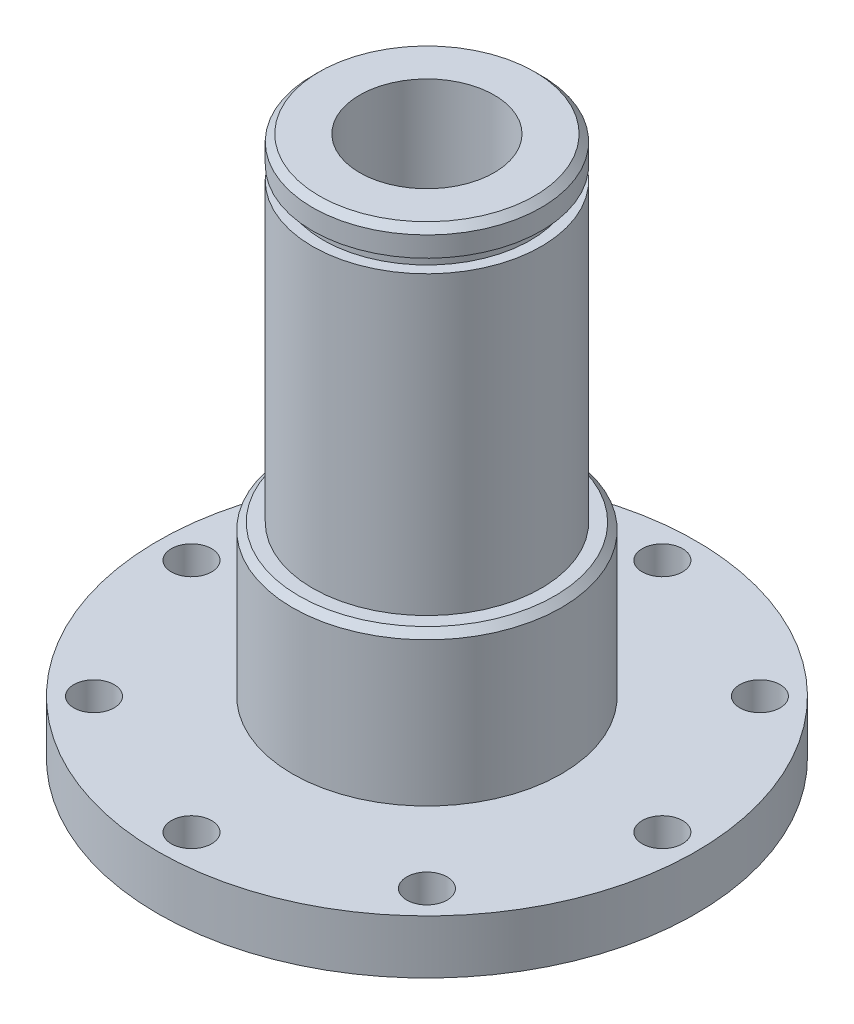
ISO-10303-21;
HEADER;
FILE_DESCRIPTION(('STEP AP214'),'2;1');
FILE_NAME('part.step','',(''),(''),'','','');
FILE_SCHEMA(('AUTOMOTIVE_DESIGN { 1 0 10303 214 1 1 1 1 }'));
ENDSEC;
DATA;
#1=APPLICATION_CONTEXT('core data for automotive mechanical design processes');
#2=APPLICATION_PROTOCOL_DEFINITION('international standard','automotive_design',2000,#1);
#3=PRODUCT_CONTEXT('',#1,'mechanical');
#4=PRODUCT('Part','Part','',(#3));
#5=PRODUCT_RELATED_PRODUCT_CATEGORY('part','',(#4));
#6=PRODUCT_DEFINITION_FORMATION('','',#4);
#7=PRODUCT_DEFINITION_CONTEXT('part definition',#1,'design');
#8=PRODUCT_DEFINITION('design','',#6,#7);
#9=PRODUCT_DEFINITION_SHAPE('','',#8);
#10=(LENGTH_UNIT() NAMED_UNIT(*) SI_UNIT(.MILLI.,.METRE.));
#11=(NAMED_UNIT(*) PLANE_ANGLE_UNIT() SI_UNIT($,.RADIAN.));
#12=(NAMED_UNIT(*) SI_UNIT($,.STERADIAN.) SOLID_ANGLE_UNIT());
#13=UNCERTAINTY_MEASURE_WITH_UNIT(LENGTH_MEASURE(1.E-05),#10,'distance_accuracy_value','');
#14=(GEOMETRIC_REPRESENTATION_CONTEXT(3) GLOBAL_UNCERTAINTY_ASSIGNED_CONTEXT((#13)) GLOBAL_UNIT_ASSIGNED_CONTEXT((#10,
#11,#12)) REPRESENTATION_CONTEXT('',''));
#15=CARTESIAN_POINT('',(0.,0.,0.));
#16=DIRECTION('',(0.,0.,1.));
#17=DIRECTION('',(1.,0.,0.));
#18=AXIS2_PLACEMENT_3D('',#15,#16,#17);
#19=CARTESIAN_POINT('',(0.,40.2,0.));
#20=DIRECTION('',(0.,-1.,0.));
#21=DIRECTION('',(0.,0.,-1.));
#22=AXIS2_PLACEMENT_3D('',#19,#20,#21);
#23=CYLINDRICAL_SURFACE('',#22,8.5);
#24=CARTESIAN_POINT('',(0.,15.2,0.));
#25=DIRECTION('',(0.,1.,0.));
#26=DIRECTION('',(0.,0.,1.));
#27=AXIS2_PLACEMENT_3D('',#24,#25,#26);
#28=CIRCLE('',#27,8.5);
#29=CARTESIAN_POINT('',(0.,15.2,8.5));
#30=VERTEX_POINT('',#29);
#31=EDGE_CURVE('E56',#30,#30,#28,.T.);
#32=ORIENTED_EDGE('',*,*,#31,.T.);
#33=EDGE_LOOP('',(#32));
#34=FACE_BOUND('',#33,.T.);
#35=CARTESIAN_POINT('',(0.,37.2,0.));
#36=DIRECTION('',(0.,1.,0.));
#37=DIRECTION('',(0.,0.,1.));
#38=AXIS2_PLACEMENT_3D('',#35,#36,#37);
#39=CIRCLE('',#38,8.5);
#40=CARTESIAN_POINT('',(0.,37.2,8.5));
#41=VERTEX_POINT('',#40);
#42=EDGE_CURVE('E120',#41,#41,#39,.T.);
#43=ORIENTED_EDGE('',*,*,#42,.F.);
#44=EDGE_LOOP('',(#43));
#45=FACE_BOUND('',#44,.T.);
#46=ADVANCED_FACE('F36',(#34,#45),#23,.T.);
#47=CARTESIAN_POINT('',(0.,39.7,0.));
#48=DIRECTION('',(0.,1.,0.));
#49=DIRECTION('',(0.,0.,1.));
#50=AXIS2_PLACEMENT_3D('',#47,#48,#49);
#51=CIRCLE('',#50,8.5);
#52=CARTESIAN_POINT('',(0.,39.7,8.5));
#53=VERTEX_POINT('',#52);
#54=EDGE_CURVE('E10',#53,#53,#51,.F.);
#55=ORIENTED_EDGE('',*,*,#54,.T.);
#56=EDGE_LOOP('',(#55));
#57=FACE_BOUND('',#56,.T.);
#58=CARTESIAN_POINT('',(0.,38.2,0.));
#59=DIRECTION('',(0.,1.,0.));
#60=DIRECTION('',(0.,0.,1.));
#61=AXIS2_PLACEMENT_3D('',#58,#59,#60);
#62=CIRCLE('',#61,8.5);
#63=CARTESIAN_POINT('',(0.,38.2,8.5));
#64=VERTEX_POINT('',#63);
#65=EDGE_CURVE('E131',#64,#64,#62,.T.);
#66=ORIENTED_EDGE('',*,*,#65,.T.);
#67=EDGE_LOOP('',(#66));
#68=FACE_BOUND('',#67,.T.);
#69=ADVANCED_FACE('F135',(#57,#68),#23,.T.);
#70=CARTESIAN_POINT('',(0.,4.,0.));
#71=DIRECTION('',(0.,-1.,0.));
#72=DIRECTION('',(0.,0.,-1.));
#73=AXIS2_PLACEMENT_3D('',#70,#71,#72);
#74=CYLINDRICAL_SURFACE('',#73,20.);
#75=CARTESIAN_POINT('',(0.,4.,0.));
#76=DIRECTION('',(0.,1.,0.));
#77=DIRECTION('',(0.,0.,1.));
#78=AXIS2_PLACEMENT_3D('',#75,#76,#77);
#79=CIRCLE('',#78,20.);
#80=CARTESIAN_POINT('',(0.,4.,20.));
#81=VERTEX_POINT('',#80);
#82=EDGE_CURVE('E60',#81,#81,#79,.T.);
#83=ORIENTED_EDGE('',*,*,#82,.F.);
#84=EDGE_LOOP('',(#83));
#85=FACE_BOUND('',#84,.T.);
#86=CARTESIAN_POINT('',(0.,0.,0.));
#87=DIRECTION('',(0.,1.,0.));
#88=DIRECTION('',(0.,0.,1.));
#89=AXIS2_PLACEMENT_3D('',#86,#87,#88);
#90=CIRCLE('',#89,20.);
#91=CARTESIAN_POINT('',(0.,0.,20.));
#92=VERTEX_POINT('',#91);
#93=EDGE_CURVE('E57',#92,#92,#90,.T.);
#94=ORIENTED_EDGE('',*,*,#93,.T.);
#95=EDGE_LOOP('',(#94));
#96=FACE_BOUND('',#95,.T.);
#97=ADVANCED_FACE('F157',(#85,#96),#74,.T.);
#98=CARTESIAN_POINT('',(0.,4.,0.));
#99=DIRECTION('',(0.,1.,0.));
#100=DIRECTION('',(0.,0.,1.));
#101=AXIS2_PLACEMENT_3D('',#98,#99,#100);
#102=PLANE('',#101);
#103=CARTESIAN_POINT('',(0.,4.,-17.5));
#104=DIRECTION('',(0.,1.,0.));
#105=DIRECTION('',(0.,0.,1.));
#106=AXIS2_PLACEMENT_3D('',#103,#104,#105);
#107=CIRCLE('',#106,1.5);
#108=CARTESIAN_POINT('',(0.,4.,-16.));
#109=VERTEX_POINT('',#108);
#110=EDGE_CURVE('E110',#109,#109,#107,.T.);
#111=ORIENTED_EDGE('',*,*,#110,.F.);
#112=EDGE_LOOP('',(#111));
#113=FACE_BOUND('',#112,.T.);
#114=CARTESIAN_POINT('',(12.3743686707648,4.,-12.3743686707651));
#115=DIRECTION('',(0.,1.,0.));
#116=DIRECTION('',(0.,0.,1.));
#117=AXIS2_PLACEMENT_3D('',#114,#115,#116);
#118=CIRCLE('',#117,1.50000000000009);
#119=CARTESIAN_POINT('',(12.3743686707648,4.,-10.874368670765));
#120=VERTEX_POINT('',#119);
#121=EDGE_CURVE('E104',#120,#120,#118,.T.);
#122=ORIENTED_EDGE('',*,*,#121,.F.);
#123=EDGE_LOOP('',(#122));
#124=FACE_BOUND('',#123,.T.);
#125=CARTESIAN_POINT('',(17.5000000000007,4.,-7.43926740649597E-13));
#126=DIRECTION('',(0.,1.,0.));
#127=DIRECTION('',(0.,0.,1.));
#128=AXIS2_PLACEMENT_3D('',#125,#126,#127);
#129=CIRCLE('',#128,1.50000000000055);
#130=CARTESIAN_POINT('',(17.5000000000007,4.,1.49999999999981));
#131=VERTEX_POINT('',#130);
#132=EDGE_CURVE('E98',#131,#131,#129,.T.);
#133=ORIENTED_EDGE('',*,*,#132,.F.);
#134=EDGE_LOOP('',(#133));
#135=FACE_BOUND('',#134,.T.);
#136=CARTESIAN_POINT('',(12.3743686707659,4.,12.3743686707641));
#137=DIRECTION('',(0.,1.,0.));
#138=DIRECTION('',(0.,0.,1.));
#139=AXIS2_PLACEMENT_3D('',#136,#137,#138);
#140=CIRCLE('',#139,1.50000000000115);
#141=CARTESIAN_POINT('',(12.3743686707659,4.,13.8743686707652));
#142=VERTEX_POINT('',#141);
#143=EDGE_CURVE('E92',#142,#142,#140,.T.);
#144=ORIENTED_EDGE('',*,*,#143,.F.);
#145=EDGE_LOOP('',(#144));
#146=FACE_BOUND('',#145,.T.);
#147=CARTESIAN_POINT('',(1.48785348129919E-12,4.,17.5));
#148=DIRECTION('',(0.,1.,0.));
#149=DIRECTION('',(0.,0.,1.));
#150=AXIS2_PLACEMENT_3D('',#147,#148,#149);
#151=CIRCLE('',#150,1.50000000000154);
#152=CARTESIAN_POINT('',(1.48785348129919E-12,4.,19.0000000000015));
#153=VERTEX_POINT('',#152);
#154=EDGE_CURVE('E86',#153,#153,#151,.T.);
#155=ORIENTED_EDGE('',*,*,#154,.F.);
#156=EDGE_LOOP('',(#155));
#157=FACE_BOUND('',#156,.T.);
#158=CARTESIAN_POINT('',(-12.3743686707633,4.,12.3743686707651));
#159=DIRECTION('',(0.,1.,0.));
#160=DIRECTION('',(0.,0.,1.));
#161=AXIS2_PLACEMENT_3D('',#158,#159,#160);
#162=CIRCLE('',#161,1.50000000000151);
#163=CARTESIAN_POINT('',(-12.3743686707633,4.,13.8743686707666));
#164=VERTEX_POINT('',#163);
#165=EDGE_CURVE('E80',#164,#164,#162,.T.);
#166=ORIENTED_EDGE('',*,*,#165,.F.);
#167=EDGE_LOOP('',(#166));
#168=FACE_BOUND('',#167,.T.);
#169=CARTESIAN_POINT('',(-17.4999999999993,4.,7.46069872548105E-13));
#170=DIRECTION('',(0.,1.,0.));
#171=DIRECTION('',(0.,0.,1.));
#172=AXIS2_PLACEMENT_3D('',#169,#170,#171);
#173=CIRCLE('',#172,1.50000000000111);
#174=CARTESIAN_POINT('',(-17.4999999999993,4.,1.50000000000185));
#175=VERTEX_POINT('',#174);
#176=EDGE_CURVE('E74',#175,#175,#173,.T.);
#177=ORIENTED_EDGE('',*,*,#176,.F.);
#178=EDGE_LOOP('',(#177));
#179=FACE_BOUND('',#178,.T.);
#180=CARTESIAN_POINT('',(-12.3743686707644,4.,-12.3743686707641));
#181=DIRECTION('',(0.,1.,0.));
#182=DIRECTION('',(0.,0.,1.));
#183=AXIS2_PLACEMENT_3D('',#180,#181,#182);
#184=CIRCLE('',#183,1.50000000000057);
#185=CARTESIAN_POINT('',(-12.3743686707644,4.,-10.8743686707635));
#186=VERTEX_POINT('',#185);
#187=EDGE_CURVE('E67',#186,#186,#184,.T.);
#188=ORIENTED_EDGE('',*,*,#187,.F.);
#189=EDGE_LOOP('',(#188));
#190=FACE_BOUND('',#189,.T.);
#191=CARTESIAN_POINT('',(0.,4.,0.));
#192=DIRECTION('',(0.,1.,0.));
#193=DIRECTION('',(0.,0.,1.));
#194=AXIS2_PLACEMENT_3D('',#191,#192,#193);
#195=CIRCLE('',#194,10.);
#196=CARTESIAN_POINT('',(0.,4.,10.));
#197=VERTEX_POINT('',#196);
#198=EDGE_CURVE('E64',#197,#197,#195,.T.);
#199=ORIENTED_EDGE('',*,*,#198,.F.);
#200=EDGE_LOOP('',(#199));
#201=FACE_BOUND('',#200,.T.);
#202=ORIENTED_EDGE('',*,*,#82,.T.);
#203=EDGE_LOOP('',(#202));
#204=FACE_BOUND('',#203,.T.);
#205=ADVANCED_FACE('F204',(#113,#124,#135,#146,#157,#168,#179,#190,#201,#204),#102,.T.);
#206=CARTESIAN_POINT('',(0.,0.,0.));
#207=DIRECTION('',(0.,1.,0.));
#208=DIRECTION('',(0.,0.,1.));
#209=AXIS2_PLACEMENT_3D('',#206,#207,#208);
#210=PLANE('',#209);
#211=CARTESIAN_POINT('',(0.,0.,0.));
#212=DIRECTION('',(0.,1.,0.));
#213=DIRECTION('',(0.,0.,1.));
#214=AXIS2_PLACEMENT_3D('',#211,#212,#213);
#215=CIRCLE('',#214,5.);
#216=CARTESIAN_POINT('',(0.,0.,5.));
#217=VERTEX_POINT('',#216);
#218=EDGE_CURVE('E71',#217,#217,#215,.T.);
#219=ORIENTED_EDGE('',*,*,#218,.T.);
#220=EDGE_LOOP('',(#219));
#221=FACE_BOUND('',#220,.T.);
#222=CARTESIAN_POINT('',(0.,0.,-17.5));
#223=DIRECTION('',(0.,1.,0.));
#224=DIRECTION('',(0.,0.,1.));
#225=AXIS2_PLACEMENT_3D('',#222,#223,#224);
#226=CIRCLE('',#225,1.5);
#227=CARTESIAN_POINT('',(0.,0.,-16.));
#228=VERTEX_POINT('',#227);
#229=EDGE_CURVE('E61',#228,#228,#226,.T.);
#230=ORIENTED_EDGE('',*,*,#229,.T.);
#231=EDGE_LOOP('',(#230));
#232=FACE_BOUND('',#231,.T.);
#233=CARTESIAN_POINT('',(12.3743686707648,0.,-12.3743686707651));
#234=DIRECTION('',(0.,1.,0.));
#235=DIRECTION('',(0.,0.,1.));
#236=AXIS2_PLACEMENT_3D('',#233,#234,#235);
#237=CIRCLE('',#236,1.50000000000009);
#238=CARTESIAN_POINT('',(12.3743686707648,0.,-10.874368670765));
#239=VERTEX_POINT('',#238);
#240=EDGE_CURVE('E107',#239,#239,#237,.T.);
#241=ORIENTED_EDGE('',*,*,#240,.T.);
#242=EDGE_LOOP('',(#241));
#243=FACE_BOUND('',#242,.T.);
#244=CARTESIAN_POINT('',(17.5000000000007,0.,-7.43926740649597E-13));
#245=DIRECTION('',(0.,1.,0.));
#246=DIRECTION('',(0.,0.,1.));
#247=AXIS2_PLACEMENT_3D('',#244,#245,#246);
#248=CIRCLE('',#247,1.50000000000055);
#249=CARTESIAN_POINT('',(17.5000000000007,0.,1.49999999999981));
#250=VERTEX_POINT('',#249);
#251=EDGE_CURVE('E101',#250,#250,#248,.T.);
#252=ORIENTED_EDGE('',*,*,#251,.T.);
#253=EDGE_LOOP('',(#252));
#254=FACE_BOUND('',#253,.T.);
#255=CARTESIAN_POINT('',(12.3743686707659,0.,12.3743686707641));
#256=DIRECTION('',(0.,1.,0.));
#257=DIRECTION('',(0.,0.,1.));
#258=AXIS2_PLACEMENT_3D('',#255,#256,#257);
#259=CIRCLE('',#258,1.50000000000115);
#260=CARTESIAN_POINT('',(12.3743686707659,0.,13.8743686707652));
#261=VERTEX_POINT('',#260);
#262=EDGE_CURVE('E95',#261,#261,#259,.T.);
#263=ORIENTED_EDGE('',*,*,#262,.T.);
#264=EDGE_LOOP('',(#263));
#265=FACE_BOUND('',#264,.T.);
#266=CARTESIAN_POINT('',(1.48785348129919E-12,0.,17.5));
#267=DIRECTION('',(0.,1.,0.));
#268=DIRECTION('',(0.,0.,1.));
#269=AXIS2_PLACEMENT_3D('',#266,#267,#268);
#270=CIRCLE('',#269,1.50000000000154);
#271=CARTESIAN_POINT('',(1.48785348129919E-12,0.,19.0000000000015));
#272=VERTEX_POINT('',#271);
#273=EDGE_CURVE('E89',#272,#272,#270,.T.);
#274=ORIENTED_EDGE('',*,*,#273,.T.);
#275=EDGE_LOOP('',(#274));
#276=FACE_BOUND('',#275,.T.);
#277=CARTESIAN_POINT('',(-12.3743686707633,0.,12.3743686707651));
#278=DIRECTION('',(0.,1.,0.));
#279=DIRECTION('',(0.,0.,1.));
#280=AXIS2_PLACEMENT_3D('',#277,#278,#279);
#281=CIRCLE('',#280,1.50000000000151);
#282=CARTESIAN_POINT('',(-12.3743686707633,0.,13.8743686707666));
#283=VERTEX_POINT('',#282);
#284=EDGE_CURVE('E83',#283,#283,#281,.T.);
#285=ORIENTED_EDGE('',*,*,#284,.T.);
#286=EDGE_LOOP('',(#285));
#287=FACE_BOUND('',#286,.T.);
#288=CARTESIAN_POINT('',(-17.4999999999993,0.,7.46069872548105E-13));
#289=DIRECTION('',(0.,1.,0.));
#290=DIRECTION('',(0.,0.,1.));
#291=AXIS2_PLACEMENT_3D('',#288,#289,#290);
#292=CIRCLE('',#291,1.50000000000111);
#293=CARTESIAN_POINT('',(-17.4999999999993,0.,1.50000000000185));
#294=VERTEX_POINT('',#293);
#295=EDGE_CURVE('E77',#294,#294,#292,.T.);
#296=ORIENTED_EDGE('',*,*,#295,.T.);
#297=EDGE_LOOP('',(#296));
#298=FACE_BOUND('',#297,.T.);
#299=CARTESIAN_POINT('',(-12.3743686707644,0.,-12.3743686707641));
#300=DIRECTION('',(0.,1.,0.));
#301=DIRECTION('',(0.,0.,1.));
#302=AXIS2_PLACEMENT_3D('',#299,#300,#301);
#303=CIRCLE('',#302,1.50000000000057);
#304=CARTESIAN_POINT('',(-12.3743686707644,0.,-10.8743686707635));
#305=VERTEX_POINT('',#304);
#306=EDGE_CURVE('E70',#305,#305,#303,.T.);
#307=ORIENTED_EDGE('',*,*,#306,.T.);
#308=EDGE_LOOP('',(#307));
#309=FACE_BOUND('',#308,.T.);
#310=ORIENTED_EDGE('',*,*,#93,.F.);
#311=EDGE_LOOP('',(#310));
#312=FACE_BOUND('',#311,.T.);
#313=ADVANCED_FACE('F202',(#221,#232,#243,#254,#265,#276,#287,#298,#309,#312),#210,.F.);
#314=CARTESIAN_POINT('',(0.,15.2,0.));
#315=DIRECTION('',(0.,-1.,0.));
#316=DIRECTION('',(0.,0.,-1.));
#317=AXIS2_PLACEMENT_3D('',#314,#315,#316);
#318=CYLINDRICAL_SURFACE('',#317,10.);
#319=CARTESIAN_POINT('',(0.,14.7,0.));
#320=DIRECTION('',(0.,1.,0.));
#321=DIRECTION('',(0.,0.,1.));
#322=AXIS2_PLACEMENT_3D('',#319,#320,#321);
#323=CIRCLE('',#322,10.);
#324=CARTESIAN_POINT('',(0.,14.7,10.));
#325=VERTEX_POINT('',#324);
#326=EDGE_CURVE('E47',#325,#325,#323,.F.);
#327=ORIENTED_EDGE('',*,*,#326,.T.);
#328=EDGE_LOOP('',(#327));
#329=FACE_BOUND('',#328,.T.);
#330=ORIENTED_EDGE('',*,*,#198,.T.);
#331=EDGE_LOOP('',(#330));
#332=FACE_BOUND('',#331,.T.);
#333=ADVANCED_FACE('F198',(#329,#332),#318,.T.);
#334=CARTESIAN_POINT('',(0.,15.2,0.));
#335=DIRECTION('',(0.,1.,0.));
#336=DIRECTION('',(0.,0.,1.));
#337=AXIS2_PLACEMENT_3D('',#334,#335,#336);
#338=PLANE('',#337);
#339=CARTESIAN_POINT('',(0.,15.2,0.));
#340=DIRECTION('',(0.,1.,0.));
#341=DIRECTION('',(0.,0.,1.));
#342=AXIS2_PLACEMENT_3D('',#339,#340,#341);
#343=CIRCLE('',#342,9.50000000000001);
#344=CARTESIAN_POINT('',(0.,15.2,9.50000000000001));
#345=VERTEX_POINT('',#344);
#346=EDGE_CURVE('E51',#345,#345,#343,.T.);
#347=ORIENTED_EDGE('',*,*,#346,.T.);
#348=EDGE_LOOP('',(#347));
#349=FACE_BOUND('',#348,.T.);
#350=ORIENTED_EDGE('',*,*,#31,.F.);
#351=EDGE_LOOP('',(#350));
#352=FACE_BOUND('',#351,.T.);
#353=ADVANCED_FACE('F194',(#349,#352),#338,.T.);
#354=CARTESIAN_POINT('',(-12.3743686707644,0.,-12.3743686707641));
#355=DIRECTION('',(0.,1.,0.));
#356=DIRECTION('',(0.,0.,1.));
#357=AXIS2_PLACEMENT_3D('',#354,#355,#356);
#358=CYLINDRICAL_SURFACE('',#357,1.50000000000057);
#359=ORIENTED_EDGE('',*,*,#306,.F.);
#360=EDGE_LOOP('',(#359));
#361=FACE_BOUND('',#360,.T.);
#362=ORIENTED_EDGE('',*,*,#187,.T.);
#363=EDGE_LOOP('',(#362));
#364=FACE_BOUND('',#363,.T.);
#365=ADVANCED_FACE('F190',(#361,#364),#358,.F.);
#366=CARTESIAN_POINT('',(-17.4999999999993,0.,7.46069872548105E-13));
#367=DIRECTION('',(0.,1.,0.));
#368=DIRECTION('',(0.,0.,1.));
#369=AXIS2_PLACEMENT_3D('',#366,#367,#368);
#370=CYLINDRICAL_SURFACE('',#369,1.50000000000111);
#371=ORIENTED_EDGE('',*,*,#295,.F.);
#372=EDGE_LOOP('',(#371));
#373=FACE_BOUND('',#372,.T.);
#374=ORIENTED_EDGE('',*,*,#176,.T.);
#375=EDGE_LOOP('',(#374));
#376=FACE_BOUND('',#375,.T.);
#377=ADVANCED_FACE('F186',(#373,#376),#370,.F.);
#378=CARTESIAN_POINT('',(-12.3743686707633,0.,12.3743686707651));
#379=DIRECTION('',(0.,1.,0.));
#380=DIRECTION('',(0.,0.,1.));
#381=AXIS2_PLACEMENT_3D('',#378,#379,#380);
#382=CYLINDRICAL_SURFACE('',#381,1.50000000000151);
#383=ORIENTED_EDGE('',*,*,#284,.F.);
#384=EDGE_LOOP('',(#383));
#385=FACE_BOUND('',#384,.T.);
#386=ORIENTED_EDGE('',*,*,#165,.T.);
#387=EDGE_LOOP('',(#386));
#388=FACE_BOUND('',#387,.T.);
#389=ADVANCED_FACE('F182',(#385,#388),#382,.F.);
#390=CARTESIAN_POINT('',(1.48785348129919E-12,0.,17.5));
#391=DIRECTION('',(0.,1.,0.));
#392=DIRECTION('',(0.,0.,1.));
#393=AXIS2_PLACEMENT_3D('',#390,#391,#392);
#394=CYLINDRICAL_SURFACE('',#393,1.50000000000154);
#395=ORIENTED_EDGE('',*,*,#273,.F.);
#396=EDGE_LOOP('',(#395));
#397=FACE_BOUND('',#396,.T.);
#398=ORIENTED_EDGE('',*,*,#154,.T.);
#399=EDGE_LOOP('',(#398));
#400=FACE_BOUND('',#399,.T.);
#401=ADVANCED_FACE('F178',(#397,#400),#394,.F.);
#402=CARTESIAN_POINT('',(12.3743686707659,0.,12.3743686707641));
#403=DIRECTION('',(0.,1.,0.));
#404=DIRECTION('',(0.,0.,1.));
#405=AXIS2_PLACEMENT_3D('',#402,#403,#404);
#406=CYLINDRICAL_SURFACE('',#405,1.50000000000115);
#407=ORIENTED_EDGE('',*,*,#262,.F.);
#408=EDGE_LOOP('',(#407));
#409=FACE_BOUND('',#408,.T.);
#410=ORIENTED_EDGE('',*,*,#143,.T.);
#411=EDGE_LOOP('',(#410));
#412=FACE_BOUND('',#411,.T.);
#413=ADVANCED_FACE('F174',(#409,#412),#406,.F.);
#414=CARTESIAN_POINT('',(17.5000000000007,0.,-7.43926740649597E-13));
#415=DIRECTION('',(0.,1.,0.));
#416=DIRECTION('',(0.,0.,1.));
#417=AXIS2_PLACEMENT_3D('',#414,#415,#416);
#418=CYLINDRICAL_SURFACE('',#417,1.50000000000055);
#419=ORIENTED_EDGE('',*,*,#251,.F.);
#420=EDGE_LOOP('',(#419));
#421=FACE_BOUND('',#420,.T.);
#422=ORIENTED_EDGE('',*,*,#132,.T.);
#423=EDGE_LOOP('',(#422));
#424=FACE_BOUND('',#423,.T.);
#425=ADVANCED_FACE('F170',(#421,#424),#418,.F.);
#426=CARTESIAN_POINT('',(12.3743686707648,0.,-12.3743686707651));
#427=DIRECTION('',(0.,1.,0.));
#428=DIRECTION('',(0.,0.,1.));
#429=AXIS2_PLACEMENT_3D('',#426,#427,#428);
#430=CYLINDRICAL_SURFACE('',#429,1.50000000000009);
#431=ORIENTED_EDGE('',*,*,#240,.F.);
#432=EDGE_LOOP('',(#431));
#433=FACE_BOUND('',#432,.T.);
#434=ORIENTED_EDGE('',*,*,#121,.T.);
#435=EDGE_LOOP('',(#434));
#436=FACE_BOUND('',#435,.T.);
#437=ADVANCED_FACE('F166',(#433,#436),#430,.F.);
#438=CARTESIAN_POINT('',(0.,0.,-17.5));
#439=DIRECTION('',(0.,1.,0.));
#440=DIRECTION('',(0.,0.,1.));
#441=AXIS2_PLACEMENT_3D('',#438,#439,#440);
#442=CYLINDRICAL_SURFACE('',#441,1.5);
#443=ORIENTED_EDGE('',*,*,#229,.F.);
#444=EDGE_LOOP('',(#443));
#445=FACE_BOUND('',#444,.T.);
#446=ORIENTED_EDGE('',*,*,#110,.T.);
#447=EDGE_LOOP('',(#446));
#448=FACE_BOUND('',#447,.T.);
#449=ADVANCED_FACE('F163',(#445,#448),#442,.F.);
#450=CARTESIAN_POINT('',(0.,40.2,0.));
#451=DIRECTION('',(0.,1.,0.));
#452=DIRECTION('',(0.,0.,1.));
#453=AXIS2_PLACEMENT_3D('',#450,#451,#452);
#454=PLANE('',#453);
#455=CARTESIAN_POINT('',(0.,40.2,0.));
#456=DIRECTION('',(0.,1.,0.));
#457=DIRECTION('',(0.,0.,1.));
#458=AXIS2_PLACEMENT_3D('',#455,#456,#457);
#459=CIRCLE('',#458,8.);
#460=CARTESIAN_POINT('',(0.,40.2,8.));
#461=VERTEX_POINT('',#460);
#462=EDGE_CURVE('E43',#461,#461,#459,.T.);
#463=ORIENTED_EDGE('',*,*,#462,.T.);
#464=EDGE_LOOP('',(#463));
#465=FACE_BOUND('',#464,.T.);
#466=CARTESIAN_POINT('',(0.,40.2,0.));
#467=DIRECTION('',(0.,1.,0.));
#468=DIRECTION('',(0.,0.,1.));
#469=AXIS2_PLACEMENT_3D('',#466,#467,#468);
#470=CIRCLE('',#469,5.);
#471=CARTESIAN_POINT('',(0.,40.2,5.));
#472=VERTEX_POINT('',#471);
#473=EDGE_CURVE('E117',#472,#472,#470,.T.);
#474=ORIENTED_EDGE('',*,*,#473,.F.);
#475=EDGE_LOOP('',(#474));
#476=FACE_BOUND('',#475,.T.);
#477=ADVANCED_FACE('F161',(#465,#476),#454,.T.);
#478=CARTESIAN_POINT('',(0.,0.,0.));
#479=DIRECTION('',(0.,1.,0.));
#480=DIRECTION('',(0.,0.,1.));
#481=AXIS2_PLACEMENT_3D('',#478,#479,#480);
#482=CYLINDRICAL_SURFACE('',#481,5.);
#483=ORIENTED_EDGE('',*,*,#218,.F.);
#484=EDGE_LOOP('',(#483));
#485=FACE_BOUND('',#484,.T.);
#486=ORIENTED_EDGE('',*,*,#473,.T.);
#487=EDGE_LOOP('',(#486));
#488=FACE_BOUND('',#487,.T.);
#489=ADVANCED_FACE('F277',(#485,#488),#482,.F.);
#490=CARTESIAN_POINT('',(8.5,37.2,0.));
#491=DIRECTION('',(0.,1.,0.));
#492=DIRECTION('',(0.,0.,1.));
#493=AXIS2_PLACEMENT_3D('',#490,#491,#492);
#494=PLANE('',#493);
#495=ORIENTED_EDGE('',*,*,#42,.T.);
#496=EDGE_LOOP('',(#495));
#497=FACE_BOUND('',#496,.T.);
#498=CARTESIAN_POINT('',(0.,37.2,0.));
#499=DIRECTION('',(0.,1.,0.));
#500=DIRECTION('',(0.,0.,1.));
#501=AXIS2_PLACEMENT_3D('',#498,#499,#500);
#502=CIRCLE('',#501,7.7);
#503=CARTESIAN_POINT('',(0.,37.2,7.7));
#504=VERTEX_POINT('',#503);
#505=EDGE_CURVE('E125',#504,#504,#502,.T.);
#506=ORIENTED_EDGE('',*,*,#505,.F.);
#507=EDGE_LOOP('',(#506));
#508=FACE_BOUND('',#507,.T.);
#509=ADVANCED_FACE('F148',(#497,#508),#494,.T.);
#510=CARTESIAN_POINT('',(0.,40.2,0.));
#511=DIRECTION('',(0.,1.,0.));
#512=DIRECTION('',(0.,0.,1.));
#513=AXIS2_PLACEMENT_3D('',#510,#511,#512);
#514=CYLINDRICAL_SURFACE('',#513,7.7);
#515=ORIENTED_EDGE('',*,*,#505,.T.);
#516=EDGE_LOOP('',(#515));
#517=FACE_BOUND('',#516,.T.);
#518=CARTESIAN_POINT('',(0.,38.2,0.));
#519=DIRECTION('',(0.,1.,0.));
#520=DIRECTION('',(0.,0.,1.));
#521=AXIS2_PLACEMENT_3D('',#518,#519,#520);
#522=CIRCLE('',#521,7.7);
#523=CARTESIAN_POINT('',(0.,38.2,7.7));
#524=VERTEX_POINT('',#523);
#525=EDGE_CURVE('E128',#524,#524,#522,.T.);
#526=ORIENTED_EDGE('',*,*,#525,.F.);
#527=EDGE_LOOP('',(#526));
#528=FACE_BOUND('',#527,.T.);
#529=ADVANCED_FACE('F140',(#517,#528),#514,.T.);
#530=CARTESIAN_POINT('',(8.5,38.2,0.));
#531=DIRECTION('',(0.,-1.,0.));
#532=DIRECTION('',(0.,0.,-1.));
#533=AXIS2_PLACEMENT_3D('',#530,#531,#532);
#534=PLANE('',#533);
#535=ORIENTED_EDGE('',*,*,#525,.T.);
#536=EDGE_LOOP('',(#535));
#537=FACE_BOUND('',#536,.T.);
#538=ORIENTED_EDGE('',*,*,#65,.F.);
#539=EDGE_LOOP('',(#538));
#540=FACE_BOUND('',#539,.T.);
#541=ADVANCED_FACE('F137',(#537,#540),#534,.T.);
#542=CARTESIAN_POINT('',(0.,15.2,0.));
#543=DIRECTION('',(0.,-1.,0.));
#544=DIRECTION('',(0.,0.,-1.));
#545=AXIS2_PLACEMENT_3D('',#542,#543,#544);
#546=CONICAL_SURFACE('',#545,9.50000000000001,0.785398163397448);
#547=ORIENTED_EDGE('',*,*,#326,.F.);
#548=EDGE_LOOP('',(#547));
#549=FACE_BOUND('',#548,.T.);
#550=ORIENTED_EDGE('',*,*,#346,.F.);
#551=EDGE_LOOP('',(#550));
#552=FACE_BOUND('',#551,.T.);
#553=ADVANCED_FACE('F139',(#549,#552),#546,.T.);
#554=CARTESIAN_POINT('',(0.,40.2,0.));
#555=DIRECTION('',(0.,-1.,0.));
#556=DIRECTION('',(0.,0.,-1.));
#557=AXIS2_PLACEMENT_3D('',#554,#555,#556);
#558=CONICAL_SURFACE('',#557,8.,0.785398163397441);
#559=ORIENTED_EDGE('',*,*,#54,.F.);
#560=EDGE_LOOP('',(#559));
#561=FACE_BOUND('',#560,.T.);
#562=ORIENTED_EDGE('',*,*,#462,.F.);
#563=EDGE_LOOP('',(#562));
#564=FACE_BOUND('',#563,.T.);
#565=ADVANCED_FACE('F38',(#561,#564),#558,.T.);
#566=CLOSED_SHELL('',(#46,#69,#97,#205,#313,#333,#353,#365,#377,#389,#401,#413,#425,#437,#449,
#477,#489,#509,#529,#541,#553,#565));
#567=MANIFOLD_SOLID_BREP('B2',#566);
#568=ADVANCED_BREP_SHAPE_REPRESENTATION('',(#18,#567),#14);
#569=SHAPE_DEFINITION_REPRESENTATION(#9,#568);
ENDSEC;
END-ISO-10303-21;
